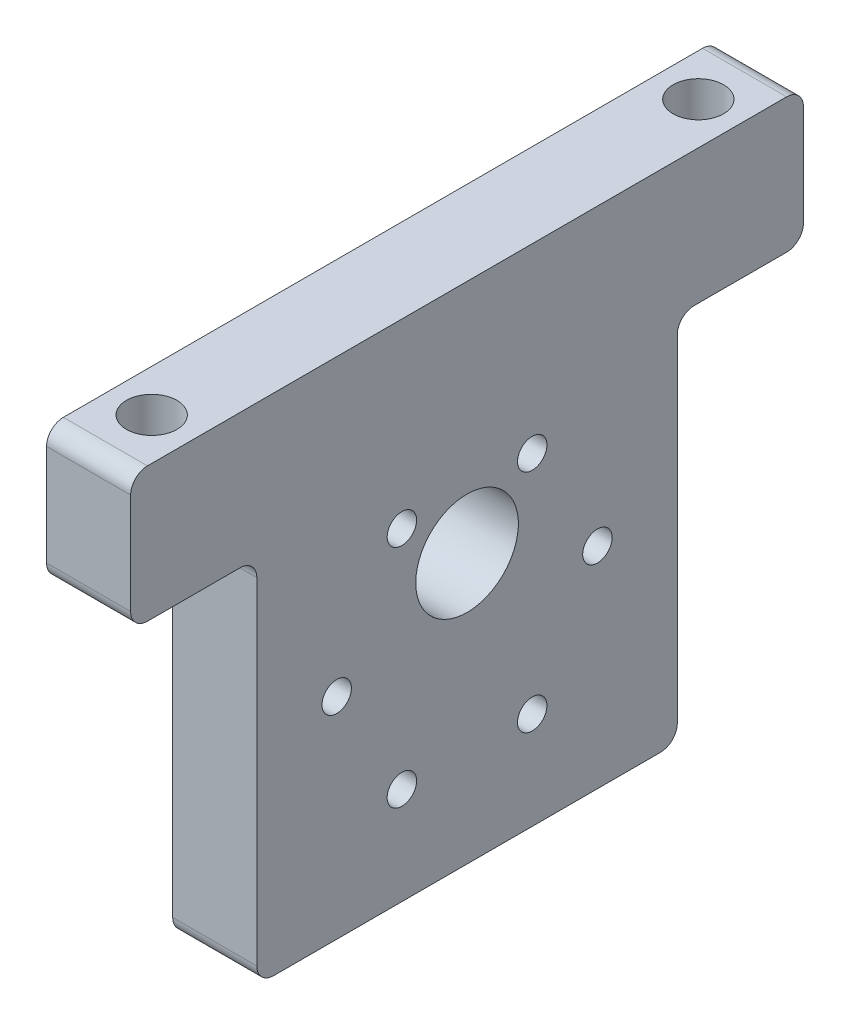
ISO-10303-21;
HEADER;
FILE_DESCRIPTION(('STEP AP214'),'2;1');
FILE_NAME('part.step','',(''),(''),'','','');
FILE_SCHEMA(('AUTOMOTIVE_DESIGN { 1 0 10303 214 1 1 1 1 }'));
ENDSEC;
DATA;
#1=APPLICATION_CONTEXT('core data for automotive mechanical design processes');
#2=APPLICATION_PROTOCOL_DEFINITION('international standard','automotive_design',2000,#1);
#3=PRODUCT_CONTEXT('',#1,'mechanical');
#4=PRODUCT('Part','Part','',(#3));
#5=PRODUCT_RELATED_PRODUCT_CATEGORY('part','',(#4));
#6=PRODUCT_DEFINITION_FORMATION('','',#4);
#7=PRODUCT_DEFINITION_CONTEXT('part definition',#1,'design');
#8=PRODUCT_DEFINITION('design','',#6,#7);
#9=PRODUCT_DEFINITION_SHAPE('','',#8);
#10=(LENGTH_UNIT() NAMED_UNIT(*) SI_UNIT(.MILLI.,.METRE.));
#11=(NAMED_UNIT(*) PLANE_ANGLE_UNIT() SI_UNIT($,.RADIAN.));
#12=(NAMED_UNIT(*) SI_UNIT($,.STERADIAN.) SOLID_ANGLE_UNIT());
#13=UNCERTAINTY_MEASURE_WITH_UNIT(LENGTH_MEASURE(1.E-05),#10,'distance_accuracy_value','');
#14=(GEOMETRIC_REPRESENTATION_CONTEXT(3) GLOBAL_UNCERTAINTY_ASSIGNED_CONTEXT((#13)) GLOBAL_UNIT_ASSIGNED_CONTEXT((#10,
#11,#12)) REPRESENTATION_CONTEXT('',''));
#15=CARTESIAN_POINT('',(0.,0.,0.));
#16=DIRECTION('',(0.,0.,1.));
#17=DIRECTION('',(1.,0.,0.));
#18=AXIS2_PLACEMENT_3D('',#15,#16,#17);
#19=CARTESIAN_POINT('',(10.,35.,40.));
#20=DIRECTION('',(0.,0.,-1.));
#21=DIRECTION('',(0.,1.,0.));
#22=AXIS2_PLACEMENT_3D('',#19,#20,#21);
#23=PLANE('',#22);
#24=DIRECTION('',(0.,-1.,0.));
#25=VECTOR('',#24,1.);
#26=CARTESIAN_POINT('',(0.,35.,40.));
#27=LINE('',#26,#25);
#28=CARTESIAN_POINT('',(0.,33.,40.));
#29=VERTEX_POINT('',#28);
#30=CARTESIAN_POINT('',(0.,21.0000000000001,40.));
#31=VERTEX_POINT('',#30);
#32=EDGE_CURVE('E234',#29,#31,#27,.T.);
#33=ORIENTED_EDGE('',*,*,#32,.T.);
#34=DIRECTION('',(1.,0.,0.));
#35=VECTOR('',#34,1.);
#36=CARTESIAN_POINT('',(10.,21.0000000000001,40.));
#37=LINE('',#36,#35);
#38=CARTESIAN_POINT('',(10.,21.0000000000001,40.));
#39=VERTEX_POINT('',#38);
#40=EDGE_CURVE('E280',#31,#39,#37,.T.);
#41=ORIENTED_EDGE('',*,*,#40,.T.);
#42=DIRECTION('',(0.,-1.,0.));
#43=VECTOR('',#42,1.);
#44=CARTESIAN_POINT('',(10.,35.,40.));
#45=LINE('',#44,#43);
#46=CARTESIAN_POINT('',(10.,33.,40.));
#47=VERTEX_POINT('',#46);
#48=EDGE_CURVE('E237',#47,#39,#45,.T.);
#49=ORIENTED_EDGE('',*,*,#48,.F.);
#50=DIRECTION('',(-1.,0.,0.));
#51=VECTOR('',#50,1.);
#52=CARTESIAN_POINT('',(10.,33.,40.));
#53=LINE('',#52,#51);
#54=EDGE_CURVE('E277',#47,#29,#53,.T.);
#55=ORIENTED_EDGE('',*,*,#54,.T.);
#56=EDGE_LOOP('',(#33,#41,#49,#55));
#57=FACE_BOUND('',#56,.T.);
#58=ADVANCED_FACE('F41',(#57),#23,.F.);
#59=CARTESIAN_POINT('',(10.,-25.,40.));
#60=DIRECTION('',(0.,1.,0.));
#61=DIRECTION('',(0.,0.,1.));
#62=AXIS2_PLACEMENT_3D('',#59,#60,#61);
#63=PLANE('',#62);
#64=DIRECTION('',(0.,0.,-1.));
#65=VECTOR('',#64,1.);
#66=CARTESIAN_POINT('',(10.,-25.,40.));
#67=LINE('',#66,#65);
#68=CARTESIAN_POINT('',(10.,-25.,23.));
#69=VERTEX_POINT('',#68);
#70=CARTESIAN_POINT('',(10.,-25.,-23.0000000000002));
#71=VERTEX_POINT('',#70);
#72=EDGE_CURVE('E239',#69,#71,#67,.T.);
#73=ORIENTED_EDGE('',*,*,#72,.F.);
#74=DIRECTION('',(1.,0.,0.));
#75=VECTOR('',#74,1.);
#76=CARTESIAN_POINT('',(10.,-25.,23.));
#77=LINE('',#76,#75);
#78=CARTESIAN_POINT('',(0.,-25.,23.));
#79=VERTEX_POINT('',#78);
#80=EDGE_CURVE('E63',#69,#79,#77,.F.);
#81=ORIENTED_EDGE('',*,*,#80,.T.);
#82=DIRECTION('',(0.,0.,-1.));
#83=VECTOR('',#82,1.);
#84=CARTESIAN_POINT('',(0.,-25.,40.));
#85=LINE('',#84,#83);
#86=CARTESIAN_POINT('',(0.,-25.,-23.0000000000002));
#87=VERTEX_POINT('',#86);
#88=EDGE_CURVE('E252',#79,#87,#85,.T.);
#89=ORIENTED_EDGE('',*,*,#88,.T.);
#90=DIRECTION('',(1.,0.,0.));
#91=VECTOR('',#90,1.);
#92=CARTESIAN_POINT('',(10.,-25.,-23.0000000000002));
#93=LINE('',#92,#91);
#94=EDGE_CURVE('E324',#87,#71,#93,.T.);
#95=ORIENTED_EDGE('',*,*,#94,.T.);
#96=EDGE_LOOP('',(#73,#81,#89,#95));
#97=FACE_BOUND('',#96,.T.);
#98=ADVANCED_FACE('F346',(#97),#63,.F.);
#99=CARTESIAN_POINT('',(10.,35.,-40.));
#100=DIRECTION('',(0.,0.,1.));
#101=DIRECTION('',(0.,-1.,0.));
#102=AXIS2_PLACEMENT_3D('',#99,#100,#101);
#103=PLANE('',#102);
#104=DIRECTION('',(0.,1.,0.));
#105=VECTOR('',#104,1.);
#106=CARTESIAN_POINT('',(0.,35.,-40.));
#107=LINE('',#106,#105);
#108=CARTESIAN_POINT('',(0.,21.0000000000001,-40.));
#109=VERTEX_POINT('',#108);
#110=CARTESIAN_POINT('',(0.,33.,-40.));
#111=VERTEX_POINT('',#110);
#112=EDGE_CURVE('E254',#109,#111,#107,.T.);
#113=ORIENTED_EDGE('',*,*,#112,.T.);
#114=DIRECTION('',(-1.,0.,0.));
#115=VECTOR('',#114,1.);
#116=CARTESIAN_POINT('',(10.,33.,-40.));
#117=LINE('',#116,#115);
#118=CARTESIAN_POINT('',(10.,33.,-40.));
#119=VERTEX_POINT('',#118);
#120=EDGE_CURVE('E312',#111,#119,#117,.F.);
#121=ORIENTED_EDGE('',*,*,#120,.T.);
#122=DIRECTION('',(0.,1.,0.));
#123=VECTOR('',#122,1.);
#124=CARTESIAN_POINT('',(10.,35.,-40.));
#125=LINE('',#124,#123);
#126=CARTESIAN_POINT('',(10.,21.0000000000001,-40.));
#127=VERTEX_POINT('',#126);
#128=EDGE_CURVE('E243',#127,#119,#125,.T.);
#129=ORIENTED_EDGE('',*,*,#128,.F.);
#130=DIRECTION('',(1.,0.,0.));
#131=VECTOR('',#130,1.);
#132=CARTESIAN_POINT('',(10.,21.0000000000001,-40.));
#133=LINE('',#132,#131);
#134=EDGE_CURVE('E310',#127,#109,#133,.F.);
#135=ORIENTED_EDGE('',*,*,#134,.T.);
#136=EDGE_LOOP('',(#113,#121,#129,#135));
#137=FACE_BOUND('',#136,.T.);
#138=ADVANCED_FACE('F378',(#137),#103,.F.);
#139=CARTESIAN_POINT('',(10.,35.,40.));
#140=DIRECTION('',(0.,-1.,0.));
#141=DIRECTION('',(0.,0.,-1.));
#142=AXIS2_PLACEMENT_3D('',#139,#140,#141);
#143=PLANE('',#142);
#144=CARTESIAN_POINT('',(5.,35.,-32.5));
#145=DIRECTION('',(0.,1.,0.));
#146=DIRECTION('',(0.,0.,1.));
#147=AXIS2_PLACEMENT_3D('',#144,#145,#146);
#148=CIRCLE('',#147,3.);
#149=CARTESIAN_POINT('',(5.,35.,-29.5));
#150=VERTEX_POINT('',#149);
#151=EDGE_CURVE('E270',#150,#150,#148,.T.);
#152=ORIENTED_EDGE('',*,*,#151,.F.);
#153=EDGE_LOOP('',(#152));
#154=FACE_BOUND('',#153,.T.);
#155=CARTESIAN_POINT('',(5.,35.,32.5));
#156=DIRECTION('',(0.,1.,0.));
#157=DIRECTION('',(0.,0.,-1.));
#158=AXIS2_PLACEMENT_3D('',#155,#156,#157);
#159=CIRCLE('',#158,3.);
#160=CARTESIAN_POINT('',(5.,35.,29.5));
#161=VERTEX_POINT('',#160);
#162=EDGE_CURVE('E680',#161,#161,#159,.T.);
#163=ORIENTED_EDGE('',*,*,#162,.F.);
#164=EDGE_LOOP('',(#163));
#165=FACE_BOUND('',#164,.T.);
#166=DIRECTION('',(0.,0.,1.));
#167=VECTOR('',#166,1.);
#168=CARTESIAN_POINT('',(0.,35.,40.));
#169=LINE('',#168,#167);
#170=CARTESIAN_POINT('',(0.,35.,-38.));
#171=VERTEX_POINT('',#170);
#172=CARTESIAN_POINT('',(0.,35.,38.));
#173=VERTEX_POINT('',#172);
#174=EDGE_CURVE('E240',#171,#173,#169,.T.);
#175=ORIENTED_EDGE('',*,*,#174,.T.);
#176=DIRECTION('',(-1.,0.,0.));
#177=VECTOR('',#176,1.);
#178=CARTESIAN_POINT('',(10.,35.,38.));
#179=LINE('',#178,#177);
#180=CARTESIAN_POINT('',(10.,35.,38.));
#181=VERTEX_POINT('',#180);
#182=EDGE_CURVE('E308',#173,#181,#179,.F.);
#183=ORIENTED_EDGE('',*,*,#182,.T.);
#184=DIRECTION('',(0.,0.,1.));
#185=VECTOR('',#184,1.);
#186=CARTESIAN_POINT('',(10.,35.,40.));
#187=LINE('',#186,#185);
#188=CARTESIAN_POINT('',(10.,35.,-38.));
#189=VERTEX_POINT('',#188);
#190=EDGE_CURVE('E246',#189,#181,#187,.T.);
#191=ORIENTED_EDGE('',*,*,#190,.F.);
#192=DIRECTION('',(-1.,0.,0.));
#193=VECTOR('',#192,1.);
#194=CARTESIAN_POINT('',(10.,35.,-38.));
#195=LINE('',#194,#193);
#196=EDGE_CURVE('E305',#189,#171,#195,.T.);
#197=ORIENTED_EDGE('',*,*,#196,.T.);
#198=EDGE_LOOP('',(#175,#183,#191,#197));
#199=FACE_BOUND('',#198,.T.);
#200=ADVANCED_FACE('F369',(#154,#165,#199),#143,.F.);
#201=CARTESIAN_POINT('',(10.,0.,0.));
#202=DIRECTION('',(1.,0.,0.));
#203=DIRECTION('',(0.,0.,-1.));
#204=AXIS2_PLACEMENT_3D('',#201,#202,#203);
#205=PLANE('',#204);
#206=ORIENTED_EDGE('',*,*,#48,.T.);
#207=CARTESIAN_POINT('',(10.,21.0000000000001,38.));
#208=DIRECTION('',(1.,0.,0.));
#209=DIRECTION('',(0.,0.,-1.));
#210=AXIS2_PLACEMENT_3D('',#207,#208,#209);
#211=CIRCLE('',#210,2.);
#212=CARTESIAN_POINT('',(10.,19.0000000000001,38.));
#213=VERTEX_POINT('',#212);
#214=EDGE_CURVE('E181',#39,#213,#211,.T.);
#215=ORIENTED_EDGE('',*,*,#214,.T.);
#216=DIRECTION('',(0.,0.,1.));
#217=VECTOR('',#216,1.);
#218=CARTESIAN_POINT('',(10.,19.0000000000001,40.));
#219=LINE('',#218,#217);
#220=CARTESIAN_POINT('',(10.,19.0000000000001,27.));
#221=VERTEX_POINT('',#220);
#222=EDGE_CURVE('E171',#221,#213,#219,.T.);
#223=ORIENTED_EDGE('',*,*,#222,.F.);
#224=CARTESIAN_POINT('',(10.,17.0000000000001,27.));
#225=DIRECTION('',(1.,0.,0.));
#226=DIRECTION('',(0.,0.,-1.));
#227=AXIS2_PLACEMENT_3D('',#224,#225,#226);
#228=CIRCLE('',#227,2.);
#229=CARTESIAN_POINT('',(10.,17.0000000000001,25.));
#230=VERTEX_POINT('',#229);
#231=EDGE_CURVE('E155',#221,#230,#228,.F.);
#232=ORIENTED_EDGE('',*,*,#231,.T.);
#233=DIRECTION('',(0.,1.,0.));
#234=VECTOR('',#233,1.);
#235=CARTESIAN_POINT('',(10.,-25.,25.));
#236=LINE('',#235,#234);
#237=CARTESIAN_POINT('',(10.,-23.,25.));
#238=VERTEX_POINT('',#237);
#239=EDGE_CURVE('E183',#238,#230,#236,.T.);
#240=ORIENTED_EDGE('',*,*,#239,.F.);
#241=CARTESIAN_POINT('',(10.,-23.,23.));
#242=DIRECTION('',(1.,0.,0.));
#243=DIRECTION('',(0.,0.,-1.));
#244=AXIS2_PLACEMENT_3D('',#241,#242,#243);
#245=CIRCLE('',#244,2.);
#246=EDGE_CURVE('E285',#238,#69,#245,.T.);
#247=ORIENTED_EDGE('',*,*,#246,.T.);
#248=ORIENTED_EDGE('',*,*,#72,.T.);
#249=CARTESIAN_POINT('',(10.,-23.,-23.0000000000002));
#250=DIRECTION('',(1.,0.,0.));
#251=DIRECTION('',(0.,0.,-1.));
#252=AXIS2_PLACEMENT_3D('',#249,#250,#251);
#253=CIRCLE('',#252,2.);
#254=CARTESIAN_POINT('',(10.,-23.,-25.0000000000002));
#255=VERTEX_POINT('',#254);
#256=EDGE_CURVE('E283',#71,#255,#253,.T.);
#257=ORIENTED_EDGE('',*,*,#256,.T.);
#258=DIRECTION('',(0.,-1.,0.));
#259=VECTOR('',#258,1.);
#260=CARTESIAN_POINT('',(10.,-24.9999999999999,-25.0000000000002));
#261=LINE('',#260,#259);
#262=CARTESIAN_POINT('',(10.,17.0000000000001,-25.));
#263=VERTEX_POINT('',#262);
#264=EDGE_CURVE('E188',#263,#255,#261,.T.);
#265=ORIENTED_EDGE('',*,*,#264,.F.);
#266=CARTESIAN_POINT('',(10.,17.0000000000001,-27.));
#267=DIRECTION('',(1.,0.,0.));
#268=DIRECTION('',(0.,0.,-1.));
#269=AXIS2_PLACEMENT_3D('',#266,#267,#268);
#270=CIRCLE('',#269,2.);
#271=CARTESIAN_POINT('',(10.,19.0000000000001,-27.));
#272=VERTEX_POINT('',#271);
#273=EDGE_CURVE('E49',#263,#272,#270,.F.);
#274=ORIENTED_EDGE('',*,*,#273,.T.);
#275=DIRECTION('',(0.,0.,1.));
#276=VECTOR('',#275,1.);
#277=CARTESIAN_POINT('',(10.,19.0000000000001,-40.));
#278=LINE('',#277,#276);
#279=CARTESIAN_POINT('',(10.,19.0000000000001,-38.));
#280=VERTEX_POINT('',#279);
#281=EDGE_CURVE('E192',#280,#272,#278,.T.);
#282=ORIENTED_EDGE('',*,*,#281,.F.);
#283=CARTESIAN_POINT('',(10.,21.0000000000001,-38.));
#284=DIRECTION('',(1.,0.,0.));
#285=DIRECTION('',(0.,0.,-1.));
#286=AXIS2_PLACEMENT_3D('',#283,#284,#285);
#287=CIRCLE('',#286,2.);
#288=EDGE_CURVE('E287',#280,#127,#287,.T.);
#289=ORIENTED_EDGE('',*,*,#288,.T.);
#290=ORIENTED_EDGE('',*,*,#128,.T.);
#291=CARTESIAN_POINT('',(10.,33.,-38.));
#292=DIRECTION('',(1.,0.,0.));
#293=DIRECTION('',(0.,0.,-1.));
#294=AXIS2_PLACEMENT_3D('',#291,#292,#293);
#295=CIRCLE('',#294,2.);
#296=EDGE_CURVE('E289',#119,#189,#295,.T.);
#297=ORIENTED_EDGE('',*,*,#296,.T.);
#298=ORIENTED_EDGE('',*,*,#190,.T.);
#299=CARTESIAN_POINT('',(10.,33.,38.));
#300=DIRECTION('',(1.,0.,0.));
#301=DIRECTION('',(0.,0.,-1.));
#302=AXIS2_PLACEMENT_3D('',#299,#300,#301);
#303=CIRCLE('',#302,2.);
#304=EDGE_CURVE('E291',#181,#47,#303,.T.);
#305=ORIENTED_EDGE('',*,*,#304,.T.);
#306=EDGE_LOOP('',(#206,#215,#223,#232,#240,#247,#248,#257,#265,#274,#282,#289,#290,#297,#298,#305));
#307=FACE_BOUND('',#306,.T.);
#308=CARTESIAN_POINT('',(10.,0.,15.5));
#309=DIRECTION('',(1.,0.,0.));
#310=DIRECTION('',(0.,0.,1.));
#311=AXIS2_PLACEMENT_3D('',#308,#309,#310);
#312=CIRCLE('',#311,1.75);
#313=CARTESIAN_POINT('',(10.,0.,17.25));
#314=VERTEX_POINT('',#313);
#315=EDGE_CURVE('E182',#314,#314,#312,.T.);
#316=ORIENTED_EDGE('',*,*,#315,.F.);
#317=EDGE_LOOP('',(#316));
#318=FACE_BOUND('',#317,.T.);
#319=CARTESIAN_POINT('',(10.,0.,-15.5));
#320=DIRECTION('',(1.,0.,0.));
#321=DIRECTION('',(0.,0.,-1.));
#322=AXIS2_PLACEMENT_3D('',#319,#320,#321);
#323=CIRCLE('',#322,1.75);
#324=CARTESIAN_POINT('',(10.,0.,-17.25));
#325=VERTEX_POINT('',#324);
#326=EDGE_CURVE('E220',#325,#325,#323,.T.);
#327=ORIENTED_EDGE('',*,*,#326,.F.);
#328=EDGE_LOOP('',(#327));
#329=FACE_BOUND('',#328,.T.);
#330=CARTESIAN_POINT('',(10.,13.4233937586588,-7.75));
#331=DIRECTION('',(1.,0.,0.));
#332=DIRECTION('',(0.,0.,1.));
#333=AXIS2_PLACEMENT_3D('',#330,#331,#332);
#334=CIRCLE('',#333,1.75);
#335=CARTESIAN_POINT('',(10.,13.4233937586588,-6.));
#336=VERTEX_POINT('',#335);
#337=EDGE_CURVE('E214',#336,#336,#334,.T.);
#338=ORIENTED_EDGE('',*,*,#337,.F.);
#339=EDGE_LOOP('',(#338));
#340=FACE_BOUND('',#339,.T.);
#341=CARTESIAN_POINT('',(10.,13.4233937586588,7.75));
#342=DIRECTION('',(1.,0.,0.));
#343=DIRECTION('',(0.,0.,-1.));
#344=AXIS2_PLACEMENT_3D('',#341,#342,#343);
#345=CIRCLE('',#344,1.75);
#346=CARTESIAN_POINT('',(10.,13.4233937586588,6.));
#347=VERTEX_POINT('',#346);
#348=EDGE_CURVE('E208',#347,#347,#345,.T.);
#349=ORIENTED_EDGE('',*,*,#348,.F.);
#350=EDGE_LOOP('',(#349));
#351=FACE_BOUND('',#350,.T.);
#352=CARTESIAN_POINT('',(10.,-13.4233937586588,7.75));
#353=DIRECTION('',(1.,0.,0.));
#354=DIRECTION('',(0.,0.,1.));
#355=AXIS2_PLACEMENT_3D('',#352,#353,#354);
#356=CIRCLE('',#355,1.75);
#357=CARTESIAN_POINT('',(10.,-13.4233937586588,9.5));
#358=VERTEX_POINT('',#357);
#359=EDGE_CURVE('E202',#358,#358,#356,.T.);
#360=ORIENTED_EDGE('',*,*,#359,.F.);
#361=EDGE_LOOP('',(#360));
#362=FACE_BOUND('',#361,.T.);
#363=CARTESIAN_POINT('',(10.,-13.4233937586588,-7.75));
#364=DIRECTION('',(1.,0.,0.));
#365=DIRECTION('',(0.,0.,-1.));
#366=AXIS2_PLACEMENT_3D('',#363,#364,#365);
#367=CIRCLE('',#366,1.75);
#368=CARTESIAN_POINT('',(10.,-13.4233937586588,-9.5));
#369=VERTEX_POINT('',#368);
#370=EDGE_CURVE('E201',#369,#369,#367,.T.);
#371=ORIENTED_EDGE('',*,*,#370,.F.);
#372=EDGE_LOOP('',(#371));
#373=FACE_BOUND('',#372,.T.);
#374=CARTESIAN_POINT('',(10.,7.,0.));
#375=DIRECTION('',(1.,0.,0.));
#376=DIRECTION('',(0.,0.,1.));
#377=AXIS2_PLACEMENT_3D('',#374,#375,#376);
#378=CIRCLE('',#377,6.1);
#379=CARTESIAN_POINT('',(10.,7.,6.1));
#380=VERTEX_POINT('',#379);
#381=EDGE_CURVE('E228',#380,#380,#378,.T.);
#382=ORIENTED_EDGE('',*,*,#381,.F.);
#383=EDGE_LOOP('',(#382));
#384=FACE_BOUND('',#383,.T.);
#385=ADVANCED_FACE('F179',(#307,#318,#329,#340,#351,#362,#373,#384),#205,.T.);
#386=CARTESIAN_POINT('',(0.,0.,0.));
#387=DIRECTION('',(1.,0.,0.));
#388=DIRECTION('',(0.,0.,-1.));
#389=AXIS2_PLACEMENT_3D('',#386,#387,#388);
#390=PLANE('',#389);
#391=CARTESIAN_POINT('',(0.,0.,15.5));
#392=DIRECTION('',(1.,0.,0.));
#393=DIRECTION('',(0.,0.,1.));
#394=AXIS2_PLACEMENT_3D('',#391,#392,#393);
#395=CIRCLE('',#394,1.75);
#396=CARTESIAN_POINT('',(0.,0.,17.25));
#397=VERTEX_POINT('',#396);
#398=EDGE_CURVE('E186',#397,#397,#395,.T.);
#399=ORIENTED_EDGE('',*,*,#398,.T.);
#400=EDGE_LOOP('',(#399));
#401=FACE_BOUND('',#400,.T.);
#402=CARTESIAN_POINT('',(0.,0.,-15.5));
#403=DIRECTION('',(1.,0.,0.));
#404=DIRECTION('',(0.,0.,-1.));
#405=AXIS2_PLACEMENT_3D('',#402,#403,#404);
#406=CIRCLE('',#405,1.75);
#407=CARTESIAN_POINT('',(0.,0.,-17.25));
#408=VERTEX_POINT('',#407);
#409=EDGE_CURVE('E217',#408,#408,#406,.T.);
#410=ORIENTED_EDGE('',*,*,#409,.T.);
#411=EDGE_LOOP('',(#410));
#412=FACE_BOUND('',#411,.T.);
#413=CARTESIAN_POINT('',(0.,13.4233937586588,-7.75));
#414=DIRECTION('',(1.,0.,0.));
#415=DIRECTION('',(0.,0.,1.));
#416=AXIS2_PLACEMENT_3D('',#413,#414,#415);
#417=CIRCLE('',#416,1.75);
#418=CARTESIAN_POINT('',(0.,13.4233937586588,-6.));
#419=VERTEX_POINT('',#418);
#420=EDGE_CURVE('E211',#419,#419,#417,.T.);
#421=ORIENTED_EDGE('',*,*,#420,.T.);
#422=EDGE_LOOP('',(#421));
#423=FACE_BOUND('',#422,.T.);
#424=CARTESIAN_POINT('',(0.,13.4233937586588,7.75));
#425=DIRECTION('',(1.,0.,0.));
#426=DIRECTION('',(0.,0.,-1.));
#427=AXIS2_PLACEMENT_3D('',#424,#425,#426);
#428=CIRCLE('',#427,1.75);
#429=CARTESIAN_POINT('',(0.,13.4233937586588,6.));
#430=VERTEX_POINT('',#429);
#431=EDGE_CURVE('E205',#430,#430,#428,.T.);
#432=ORIENTED_EDGE('',*,*,#431,.T.);
#433=EDGE_LOOP('',(#432));
#434=FACE_BOUND('',#433,.T.);
#435=CARTESIAN_POINT('',(0.,-13.4233937586588,7.75));
#436=DIRECTION('',(1.,0.,0.));
#437=DIRECTION('',(0.,0.,1.));
#438=AXIS2_PLACEMENT_3D('',#435,#436,#437);
#439=CIRCLE('',#438,1.75);
#440=CARTESIAN_POINT('',(0.,-13.4233937586588,9.5));
#441=VERTEX_POINT('',#440);
#442=EDGE_CURVE('E198',#441,#441,#439,.T.);
#443=ORIENTED_EDGE('',*,*,#442,.T.);
#444=EDGE_LOOP('',(#443));
#445=FACE_BOUND('',#444,.T.);
#446=CARTESIAN_POINT('',(0.,-13.4233937586588,-7.75));
#447=DIRECTION('',(1.,0.,0.));
#448=DIRECTION('',(0.,0.,-1.));
#449=AXIS2_PLACEMENT_3D('',#446,#447,#448);
#450=CIRCLE('',#449,1.75);
#451=CARTESIAN_POINT('',(0.,-13.4233937586588,-9.5));
#452=VERTEX_POINT('',#451);
#453=EDGE_CURVE('E225',#452,#452,#450,.T.);
#454=ORIENTED_EDGE('',*,*,#453,.T.);
#455=EDGE_LOOP('',(#454));
#456=FACE_BOUND('',#455,.T.);
#457=CARTESIAN_POINT('',(0.,7.,0.));
#458=DIRECTION('',(1.,0.,0.));
#459=DIRECTION('',(0.,0.,1.));
#460=AXIS2_PLACEMENT_3D('',#457,#458,#459);
#461=CIRCLE('',#460,6.1);
#462=CARTESIAN_POINT('',(0.,7.,6.1));
#463=VERTEX_POINT('',#462);
#464=EDGE_CURVE('E231',#463,#463,#461,.T.);
#465=ORIENTED_EDGE('',*,*,#464,.T.);
#466=EDGE_LOOP('',(#465));
#467=FACE_BOUND('',#466,.T.);
#468=DIRECTION('',(0.,0.,1.));
#469=VECTOR('',#468,1.);
#470=CARTESIAN_POINT('',(0.,19.0000000000001,0.));
#471=LINE('',#470,#469);
#472=CARTESIAN_POINT('',(0.,19.0000000000001,27.));
#473=VERTEX_POINT('',#472);
#474=CARTESIAN_POINT('',(0.,19.0000000000001,38.));
#475=VERTEX_POINT('',#474);
#476=EDGE_CURVE('E174',#473,#475,#471,.T.);
#477=ORIENTED_EDGE('',*,*,#476,.T.);
#478=CARTESIAN_POINT('',(0.,21.0000000000001,38.));
#479=DIRECTION('',(1.,0.,0.));
#480=DIRECTION('',(0.,0.,-1.));
#481=AXIS2_PLACEMENT_3D('',#478,#479,#480);
#482=CIRCLE('',#481,2.);
#483=EDGE_CURVE('E303',#475,#31,#482,.F.);
#484=ORIENTED_EDGE('',*,*,#483,.T.);
#485=ORIENTED_EDGE('',*,*,#32,.F.);
#486=CARTESIAN_POINT('',(0.,33.,38.));
#487=DIRECTION('',(1.,0.,0.));
#488=DIRECTION('',(0.,0.,-1.));
#489=AXIS2_PLACEMENT_3D('',#486,#487,#488);
#490=CIRCLE('',#489,2.);
#491=EDGE_CURVE('E301',#29,#173,#490,.F.);
#492=ORIENTED_EDGE('',*,*,#491,.T.);
#493=ORIENTED_EDGE('',*,*,#174,.F.);
#494=CARTESIAN_POINT('',(0.,33.,-38.));
#495=DIRECTION('',(1.,0.,0.));
#496=DIRECTION('',(0.,0.,-1.));
#497=AXIS2_PLACEMENT_3D('',#494,#495,#496);
#498=CIRCLE('',#497,2.);
#499=EDGE_CURVE('E299',#171,#111,#498,.F.);
#500=ORIENTED_EDGE('',*,*,#499,.T.);
#501=ORIENTED_EDGE('',*,*,#112,.F.);
#502=CARTESIAN_POINT('',(0.,21.0000000000001,-38.));
#503=DIRECTION('',(1.,0.,0.));
#504=DIRECTION('',(0.,0.,-1.));
#505=AXIS2_PLACEMENT_3D('',#502,#503,#504);
#506=CIRCLE('',#505,2.);
#507=CARTESIAN_POINT('',(0.,19.0000000000001,-38.));
#508=VERTEX_POINT('',#507);
#509=EDGE_CURVE('E297',#109,#508,#506,.F.);
#510=ORIENTED_EDGE('',*,*,#509,.T.);
#511=DIRECTION('',(0.,0.,1.));
#512=VECTOR('',#511,1.);
#513=CARTESIAN_POINT('',(0.,19.0000000000001,0.));
#514=LINE('',#513,#512);
#515=CARTESIAN_POINT('',(0.,19.0000000000001,-27.));
#516=VERTEX_POINT('',#515);
#517=EDGE_CURVE('E249',#508,#516,#514,.T.);
#518=ORIENTED_EDGE('',*,*,#517,.T.);
#519=CARTESIAN_POINT('',(0.,17.0000000000001,-27.));
#520=DIRECTION('',(1.,0.,0.));
#521=DIRECTION('',(0.,0.,-1.));
#522=AXIS2_PLACEMENT_3D('',#519,#520,#521);
#523=CIRCLE('',#522,2.);
#524=CARTESIAN_POINT('',(0.,17.0000000000001,-25.));
#525=VERTEX_POINT('',#524);
#526=EDGE_CURVE('E11',#516,#525,#523,.T.);
#527=ORIENTED_EDGE('',*,*,#526,.T.);
#528=DIRECTION('',(0.,-1.,0.));
#529=VECTOR('',#528,1.);
#530=CARTESIAN_POINT('',(0.,0.,-25.0000000000001));
#531=LINE('',#530,#529);
#532=CARTESIAN_POINT('',(0.,-23.,-25.0000000000002));
#533=VERTEX_POINT('',#532);
#534=EDGE_CURVE('E261',#525,#533,#531,.T.);
#535=ORIENTED_EDGE('',*,*,#534,.T.);
#536=CARTESIAN_POINT('',(0.,-23.,-23.0000000000002));
#537=DIRECTION('',(1.,0.,0.));
#538=DIRECTION('',(0.,0.,-1.));
#539=AXIS2_PLACEMENT_3D('',#536,#537,#538);
#540=CIRCLE('',#539,2.);
#541=EDGE_CURVE('E56',#533,#87,#540,.F.);
#542=ORIENTED_EDGE('',*,*,#541,.T.);
#543=ORIENTED_EDGE('',*,*,#88,.F.);
#544=CARTESIAN_POINT('',(0.,-23.,23.));
#545=DIRECTION('',(1.,0.,0.));
#546=DIRECTION('',(0.,0.,-1.));
#547=AXIS2_PLACEMENT_3D('',#544,#545,#546);
#548=CIRCLE('',#547,2.);
#549=CARTESIAN_POINT('',(0.,-23.,25.));
#550=VERTEX_POINT('',#549);
#551=EDGE_CURVE('E295',#79,#550,#548,.F.);
#552=ORIENTED_EDGE('',*,*,#551,.T.);
#553=DIRECTION('',(0.,1.,0.));
#554=VECTOR('',#553,1.);
#555=CARTESIAN_POINT('',(0.,0.,25.));
#556=LINE('',#555,#554);
#557=CARTESIAN_POINT('',(0.,17.0000000000001,25.));
#558=VERTEX_POINT('',#557);
#559=EDGE_CURVE('E263',#550,#558,#556,.T.);
#560=ORIENTED_EDGE('',*,*,#559,.T.);
#561=CARTESIAN_POINT('',(0.,17.0000000000001,27.));
#562=DIRECTION('',(1.,0.,0.));
#563=DIRECTION('',(0.,0.,-1.));
#564=AXIS2_PLACEMENT_3D('',#561,#562,#563);
#565=CIRCLE('',#564,2.);
#566=EDGE_CURVE('E165',#558,#473,#565,.T.);
#567=ORIENTED_EDGE('',*,*,#566,.T.);
#568=EDGE_LOOP('',(#477,#484,#485,#492,#493,#500,#501,#510,#518,#527,#535,#542,#543,#552,#560,#567));
#569=FACE_BOUND('',#568,.T.);
#570=ADVANCED_FACE('F340',(#401,#412,#423,#434,#445,#456,#467,#569),#390,.F.);
#571=CARTESIAN_POINT('',(0.,7.,0.));
#572=DIRECTION('',(1.,0.,0.));
#573=DIRECTION('',(0.,0.,-1.));
#574=AXIS2_PLACEMENT_3D('',#571,#572,#573);
#575=CYLINDRICAL_SURFACE('',#574,6.1);
#576=ORIENTED_EDGE('',*,*,#464,.F.);
#577=EDGE_LOOP('',(#576));
#578=FACE_BOUND('',#577,.T.);
#579=ORIENTED_EDGE('',*,*,#381,.T.);
#580=EDGE_LOOP('',(#579));
#581=FACE_BOUND('',#580,.T.);
#582=ADVANCED_FACE('F573',(#578,#581),#575,.F.);
#583=CARTESIAN_POINT('',(0.,-13.4233937586588,-7.75));
#584=DIRECTION('',(1.,0.,0.));
#585=DIRECTION('',(0.,0.,-1.));
#586=AXIS2_PLACEMENT_3D('',#583,#584,#585);
#587=CYLINDRICAL_SURFACE('',#586,1.75);
#588=ORIENTED_EDGE('',*,*,#453,.F.);
#589=EDGE_LOOP('',(#588));
#590=FACE_BOUND('',#589,.T.);
#591=ORIENTED_EDGE('',*,*,#370,.T.);
#592=EDGE_LOOP('',(#591));
#593=FACE_BOUND('',#592,.T.);
#594=ADVANCED_FACE('F563',(#590,#593),#587,.F.);
#595=CARTESIAN_POINT('',(0.,-13.4233937586588,7.75));
#596=DIRECTION('',(1.,0.,0.));
#597=DIRECTION('',(0.,0.,-1.));
#598=AXIS2_PLACEMENT_3D('',#595,#596,#597);
#599=CYLINDRICAL_SURFACE('',#598,1.75);
#600=ORIENTED_EDGE('',*,*,#442,.F.);
#601=EDGE_LOOP('',(#600));
#602=FACE_BOUND('',#601,.T.);
#603=ORIENTED_EDGE('',*,*,#359,.T.);
#604=EDGE_LOOP('',(#603));
#605=FACE_BOUND('',#604,.T.);
#606=ADVANCED_FACE('F553',(#602,#605),#599,.F.);
#607=CARTESIAN_POINT('',(0.,13.4233937586588,7.75));
#608=DIRECTION('',(1.,0.,0.));
#609=DIRECTION('',(0.,0.,-1.));
#610=AXIS2_PLACEMENT_3D('',#607,#608,#609);
#611=CYLINDRICAL_SURFACE('',#610,1.75);
#612=ORIENTED_EDGE('',*,*,#431,.F.);
#613=EDGE_LOOP('',(#612));
#614=FACE_BOUND('',#613,.T.);
#615=ORIENTED_EDGE('',*,*,#348,.T.);
#616=EDGE_LOOP('',(#615));
#617=FACE_BOUND('',#616,.T.);
#618=ADVANCED_FACE('F543',(#614,#617),#611,.F.);
#619=CARTESIAN_POINT('',(0.,13.4233937586588,-7.75));
#620=DIRECTION('',(1.,0.,0.));
#621=DIRECTION('',(0.,0.,-1.));
#622=AXIS2_PLACEMENT_3D('',#619,#620,#621);
#623=CYLINDRICAL_SURFACE('',#622,1.75);
#624=ORIENTED_EDGE('',*,*,#420,.F.);
#625=EDGE_LOOP('',(#624));
#626=FACE_BOUND('',#625,.T.);
#627=ORIENTED_EDGE('',*,*,#337,.T.);
#628=EDGE_LOOP('',(#627));
#629=FACE_BOUND('',#628,.T.);
#630=ADVANCED_FACE('F533',(#626,#629),#623,.F.);
#631=CARTESIAN_POINT('',(0.,0.,-15.5));
#632=DIRECTION('',(1.,0.,0.));
#633=DIRECTION('',(0.,0.,-1.));
#634=AXIS2_PLACEMENT_3D('',#631,#632,#633);
#635=CYLINDRICAL_SURFACE('',#634,1.75);
#636=ORIENTED_EDGE('',*,*,#409,.F.);
#637=EDGE_LOOP('',(#636));
#638=FACE_BOUND('',#637,.T.);
#639=ORIENTED_EDGE('',*,*,#326,.T.);
#640=EDGE_LOOP('',(#639));
#641=FACE_BOUND('',#640,.T.);
#642=ADVANCED_FACE('F523',(#638,#641),#635,.F.);
#643=CARTESIAN_POINT('',(0.,0.,15.5));
#644=DIRECTION('',(1.,0.,0.));
#645=DIRECTION('',(0.,0.,-1.));
#646=AXIS2_PLACEMENT_3D('',#643,#644,#645);
#647=CYLINDRICAL_SURFACE('',#646,1.75);
#648=ORIENTED_EDGE('',*,*,#398,.F.);
#649=EDGE_LOOP('',(#648));
#650=FACE_BOUND('',#649,.T.);
#651=ORIENTED_EDGE('',*,*,#315,.T.);
#652=EDGE_LOOP('',(#651));
#653=FACE_BOUND('',#652,.T.);
#654=ADVANCED_FACE('F514',(#650,#653),#647,.F.);
#655=CARTESIAN_POINT('',(-40.,-24.9999999999999,-25.0000000000002));
#656=DIRECTION('',(0.,0.,1.));
#657=DIRECTION('',(0.,-1.,0.));
#658=AXIS2_PLACEMENT_3D('',#655,#656,#657);
#659=PLANE('',#658);
#660=ORIENTED_EDGE('',*,*,#534,.F.);
#661=DIRECTION('',(1.,0.,0.));
#662=VECTOR('',#661,1.);
#663=CARTESIAN_POINT('',(10.,17.0000000000001,-25.));
#664=LINE('',#663,#662);
#665=EDGE_CURVE('E316',#525,#263,#664,.T.);
#666=ORIENTED_EDGE('',*,*,#665,.T.);
#667=ORIENTED_EDGE('',*,*,#264,.T.);
#668=DIRECTION('',(1.,0.,0.));
#669=VECTOR('',#668,1.);
#670=CARTESIAN_POINT('',(-40.,-23.,-25.0000000000002));
#671=LINE('',#670,#669);
#672=EDGE_CURVE('E314',#255,#533,#671,.F.);
#673=ORIENTED_EDGE('',*,*,#672,.T.);
#674=EDGE_LOOP('',(#660,#666,#667,#673));
#675=FACE_BOUND('',#674,.T.);
#676=ADVANCED_FACE('F342',(#675),#659,.F.);
#677=CARTESIAN_POINT('',(-40.,19.0000000000001,-40.));
#678=DIRECTION('',(0.,1.,0.));
#679=DIRECTION('',(0.,0.,1.));
#680=AXIS2_PLACEMENT_3D('',#677,#678,#679);
#681=PLANE('',#680);
#682=CARTESIAN_POINT('',(5.,19.0000000000001,-32.5));
#683=DIRECTION('',(0.,1.,0.));
#684=DIRECTION('',(0.,0.,1.));
#685=AXIS2_PLACEMENT_3D('',#682,#683,#684);
#686=CIRCLE('',#685,3.);
#687=CARTESIAN_POINT('',(5.,19.0000000000001,-29.5));
#688=VERTEX_POINT('',#687);
#689=EDGE_CURVE('E195',#688,#688,#686,.T.);
#690=ORIENTED_EDGE('',*,*,#689,.T.);
#691=EDGE_LOOP('',(#690));
#692=FACE_BOUND('',#691,.T.);
#693=ORIENTED_EDGE('',*,*,#281,.T.);
#694=DIRECTION('',(1.,0.,0.));
#695=VECTOR('',#694,1.);
#696=CARTESIAN_POINT('',(0.,19.0000000000001,-27.));
#697=LINE('',#696,#695);
#698=EDGE_CURVE('E322',#272,#516,#697,.F.);
#699=ORIENTED_EDGE('',*,*,#698,.T.);
#700=ORIENTED_EDGE('',*,*,#517,.F.);
#701=DIRECTION('',(1.,0.,0.));
#702=VECTOR('',#701,1.);
#703=CARTESIAN_POINT('',(-40.,19.0000000000001,-38.));
#704=LINE('',#703,#702);
#705=EDGE_CURVE('E319',#508,#280,#704,.T.);
#706=ORIENTED_EDGE('',*,*,#705,.T.);
#707=EDGE_LOOP('',(#693,#699,#700,#706));
#708=FACE_BOUND('',#707,.T.);
#709=ADVANCED_FACE('F334',(#692,#708),#681,.F.);
#710=CARTESIAN_POINT('',(-40.,19.0000000000001,40.));
#711=DIRECTION('',(0.,1.,0.));
#712=DIRECTION('',(0.,0.,1.));
#713=AXIS2_PLACEMENT_3D('',#710,#711,#712);
#714=PLANE('',#713);
#715=CARTESIAN_POINT('',(5.,19.0000000000001,32.5));
#716=DIRECTION('',(0.,1.,0.));
#717=DIRECTION('',(0.,0.,1.));
#718=AXIS2_PLACEMENT_3D('',#715,#716,#717);
#719=CIRCLE('',#718,3.);
#720=CARTESIAN_POINT('',(5.,19.0000000000001,35.5));
#721=VERTEX_POINT('',#720);
#722=EDGE_CURVE('E267',#721,#721,#719,.T.);
#723=ORIENTED_EDGE('',*,*,#722,.T.);
#724=EDGE_LOOP('',(#723));
#725=FACE_BOUND('',#724,.T.);
#726=ORIENTED_EDGE('',*,*,#476,.F.);
#727=DIRECTION('',(1.,0.,0.));
#728=VECTOR('',#727,1.);
#729=CARTESIAN_POINT('',(10.,19.0000000000001,27.));
#730=LINE('',#729,#728);
#731=EDGE_CURVE('E159',#473,#221,#730,.T.);
#732=ORIENTED_EDGE('',*,*,#731,.T.);
#733=ORIENTED_EDGE('',*,*,#222,.T.);
#734=DIRECTION('',(1.,0.,0.));
#735=VECTOR('',#734,1.);
#736=CARTESIAN_POINT('',(-40.,19.0000000000001,38.));
#737=LINE('',#736,#735);
#738=EDGE_CURVE('E176',#213,#475,#737,.F.);
#739=ORIENTED_EDGE('',*,*,#738,.T.);
#740=EDGE_LOOP('',(#726,#732,#733,#739));
#741=FACE_BOUND('',#740,.T.);
#742=ADVANCED_FACE('F170',(#725,#741),#714,.F.);
#743=CARTESIAN_POINT('',(-40.,-25.,25.));
#744=DIRECTION('',(0.,0.,-1.));
#745=DIRECTION('',(0.,1.,0.));
#746=AXIS2_PLACEMENT_3D('',#743,#744,#745);
#747=PLANE('',#746);
#748=ORIENTED_EDGE('',*,*,#239,.T.);
#749=DIRECTION('',(1.,0.,0.));
#750=VECTOR('',#749,1.);
#751=CARTESIAN_POINT('',(0.,17.0000000000001,25.));
#752=LINE('',#751,#750);
#753=EDGE_CURVE('E160',#230,#558,#752,.F.);
#754=ORIENTED_EDGE('',*,*,#753,.T.);
#755=ORIENTED_EDGE('',*,*,#559,.F.);
#756=DIRECTION('',(1.,0.,0.));
#757=VECTOR('',#756,1.);
#758=CARTESIAN_POINT('',(-40.,-23.,25.));
#759=LINE('',#758,#757);
#760=EDGE_CURVE('E175',#550,#238,#759,.T.);
#761=ORIENTED_EDGE('',*,*,#760,.T.);
#762=EDGE_LOOP('',(#748,#754,#755,#761));
#763=FACE_BOUND('',#762,.T.);
#764=ADVANCED_FACE('F353',(#763),#747,.F.);
#765=CARTESIAN_POINT('',(5.,-15.,32.5));
#766=DIRECTION('',(0.,1.,0.));
#767=DIRECTION('',(0.,0.,1.));
#768=AXIS2_PLACEMENT_3D('',#765,#766,#767);
#769=CYLINDRICAL_SURFACE('',#768,3.);
#770=ORIENTED_EDGE('',*,*,#162,.T.);
#771=EDGE_LOOP('',(#770));
#772=FACE_BOUND('',#771,.T.);
#773=ORIENTED_EDGE('',*,*,#722,.F.);
#774=EDGE_LOOP('',(#773));
#775=FACE_BOUND('',#774,.T.);
#776=ADVANCED_FACE('F469',(#772,#775),#769,.F.);
#777=CARTESIAN_POINT('',(5.,-15.,-32.5));
#778=DIRECTION('',(0.,1.,0.));
#779=DIRECTION('',(0.,0.,1.));
#780=AXIS2_PLACEMENT_3D('',#777,#778,#779);
#781=CYLINDRICAL_SURFACE('',#780,3.);
#782=ORIENTED_EDGE('',*,*,#151,.T.);
#783=EDGE_LOOP('',(#782));
#784=FACE_BOUND('',#783,.T.);
#785=ORIENTED_EDGE('',*,*,#689,.F.);
#786=EDGE_LOOP('',(#785));
#787=FACE_BOUND('',#786,.T.);
#788=ADVANCED_FACE('F400',(#784,#787),#781,.F.);
#789=CARTESIAN_POINT('',(-40.,17.0000000000001,27.));
#790=DIRECTION('',(-1.,0.,0.));
#791=DIRECTION('',(0.,0.,1.));
#792=AXIS2_PLACEMENT_3D('',#789,#790,#791);
#793=CYLINDRICAL_SURFACE('',#792,2.);
#794=ORIENTED_EDGE('',*,*,#566,.F.);
#795=ORIENTED_EDGE('',*,*,#753,.F.);
#796=ORIENTED_EDGE('',*,*,#231,.F.);
#797=ORIENTED_EDGE('',*,*,#731,.F.);
#798=EDGE_LOOP('',(#794,#795,#796,#797));
#799=FACE_BOUND('',#798,.T.);
#800=ADVANCED_FACE('F158',(#799),#793,.F.);
#801=CARTESIAN_POINT('',(10.,21.0000000000001,38.));
#802=DIRECTION('',(1.,0.,0.));
#803=DIRECTION('',(0.,0.,-1.));
#804=AXIS2_PLACEMENT_3D('',#801,#802,#803);
#805=CYLINDRICAL_SURFACE('',#804,2.);
#806=ORIENTED_EDGE('',*,*,#483,.F.);
#807=ORIENTED_EDGE('',*,*,#738,.F.);
#808=ORIENTED_EDGE('',*,*,#214,.F.);
#809=ORIENTED_EDGE('',*,*,#40,.F.);
#810=EDGE_LOOP('',(#806,#807,#808,#809));
#811=FACE_BOUND('',#810,.T.);
#812=ADVANCED_FACE('F358',(#811),#805,.T.);
#813=CARTESIAN_POINT('',(10.,33.,38.));
#814=DIRECTION('',(-1.,0.,0.));
#815=DIRECTION('',(0.,0.,1.));
#816=AXIS2_PLACEMENT_3D('',#813,#814,#815);
#817=CYLINDRICAL_SURFACE('',#816,2.);
#818=ORIENTED_EDGE('',*,*,#304,.F.);
#819=ORIENTED_EDGE('',*,*,#182,.F.);
#820=ORIENTED_EDGE('',*,*,#491,.F.);
#821=ORIENTED_EDGE('',*,*,#54,.F.);
#822=EDGE_LOOP('',(#818,#819,#820,#821));
#823=FACE_BOUND('',#822,.T.);
#824=ADVANCED_FACE('F366',(#823),#817,.T.);
#825=CARTESIAN_POINT('',(10.,33.,-38.));
#826=DIRECTION('',(-1.,0.,0.));
#827=DIRECTION('',(0.,0.,1.));
#828=AXIS2_PLACEMENT_3D('',#825,#826,#827);
#829=CYLINDRICAL_SURFACE('',#828,2.);
#830=ORIENTED_EDGE('',*,*,#296,.F.);
#831=ORIENTED_EDGE('',*,*,#120,.F.);
#832=ORIENTED_EDGE('',*,*,#499,.F.);
#833=ORIENTED_EDGE('',*,*,#196,.F.);
#834=EDGE_LOOP('',(#830,#831,#832,#833));
#835=FACE_BOUND('',#834,.T.);
#836=ADVANCED_FACE('F373',(#835),#829,.T.);
#837=CARTESIAN_POINT('',(-40.,17.0000000000001,-27.));
#838=DIRECTION('',(-1.,0.,0.));
#839=DIRECTION('',(0.,0.,1.));
#840=AXIS2_PLACEMENT_3D('',#837,#838,#839);
#841=CYLINDRICAL_SURFACE('',#840,2.);
#842=ORIENTED_EDGE('',*,*,#526,.F.);
#843=ORIENTED_EDGE('',*,*,#698,.F.);
#844=ORIENTED_EDGE('',*,*,#273,.F.);
#845=ORIENTED_EDGE('',*,*,#665,.F.);
#846=EDGE_LOOP('',(#842,#843,#844,#845));
#847=FACE_BOUND('',#846,.T.);
#848=ADVANCED_FACE('F338',(#847),#841,.F.);
#849=CARTESIAN_POINT('',(-40.,21.0000000000001,-38.));
#850=DIRECTION('',(1.,0.,0.));
#851=DIRECTION('',(0.,0.,-1.));
#852=AXIS2_PLACEMENT_3D('',#849,#850,#851);
#853=CYLINDRICAL_SURFACE('',#852,2.);
#854=ORIENTED_EDGE('',*,*,#509,.F.);
#855=ORIENTED_EDGE('',*,*,#134,.F.);
#856=ORIENTED_EDGE('',*,*,#288,.F.);
#857=ORIENTED_EDGE('',*,*,#705,.F.);
#858=EDGE_LOOP('',(#854,#855,#856,#857));
#859=FACE_BOUND('',#858,.T.);
#860=ADVANCED_FACE('F382',(#859),#853,.T.);
#861=CARTESIAN_POINT('',(-40.,-23.,23.));
#862=DIRECTION('',(1.,0.,0.));
#863=DIRECTION('',(0.,0.,-1.));
#864=AXIS2_PLACEMENT_3D('',#861,#862,#863);
#865=CYLINDRICAL_SURFACE('',#864,2.);
#866=ORIENTED_EDGE('',*,*,#551,.F.);
#867=ORIENTED_EDGE('',*,*,#80,.F.);
#868=ORIENTED_EDGE('',*,*,#246,.F.);
#869=ORIENTED_EDGE('',*,*,#760,.F.);
#870=EDGE_LOOP('',(#866,#867,#868,#869));
#871=FACE_BOUND('',#870,.T.);
#872=ADVANCED_FACE('F350',(#871),#865,.T.);
#873=CARTESIAN_POINT('',(10.,-23.,-23.0000000000002));
#874=DIRECTION('',(1.,0.,0.));
#875=DIRECTION('',(0.,0.,-1.));
#876=AXIS2_PLACEMENT_3D('',#873,#874,#875);
#877=CYLINDRICAL_SURFACE('',#876,2.);
#878=ORIENTED_EDGE('',*,*,#541,.F.);
#879=ORIENTED_EDGE('',*,*,#672,.F.);
#880=ORIENTED_EDGE('',*,*,#256,.F.);
#881=ORIENTED_EDGE('',*,*,#94,.F.);
#882=EDGE_LOOP('',(#878,#879,#880,#881));
#883=FACE_BOUND('',#882,.T.);
#884=ADVANCED_FACE('F43',(#883),#877,.T.);
#885=CLOSED_SHELL('',(#58,#98,#138,#200,#385,#570,#582,#594,#606,#618,#630,#642,#654,#676,#709,
#742,#764,#776,#788,#800,#812,#824,#836,#848,#860,#872,#884));
#886=MANIFOLD_SOLID_BREP('B2',#885);
#887=ADVANCED_BREP_SHAPE_REPRESENTATION('',(#18,#886),#14);
#888=SHAPE_DEFINITION_REPRESENTATION(#9,#887);
ENDSEC;
END-ISO-10303-21;
